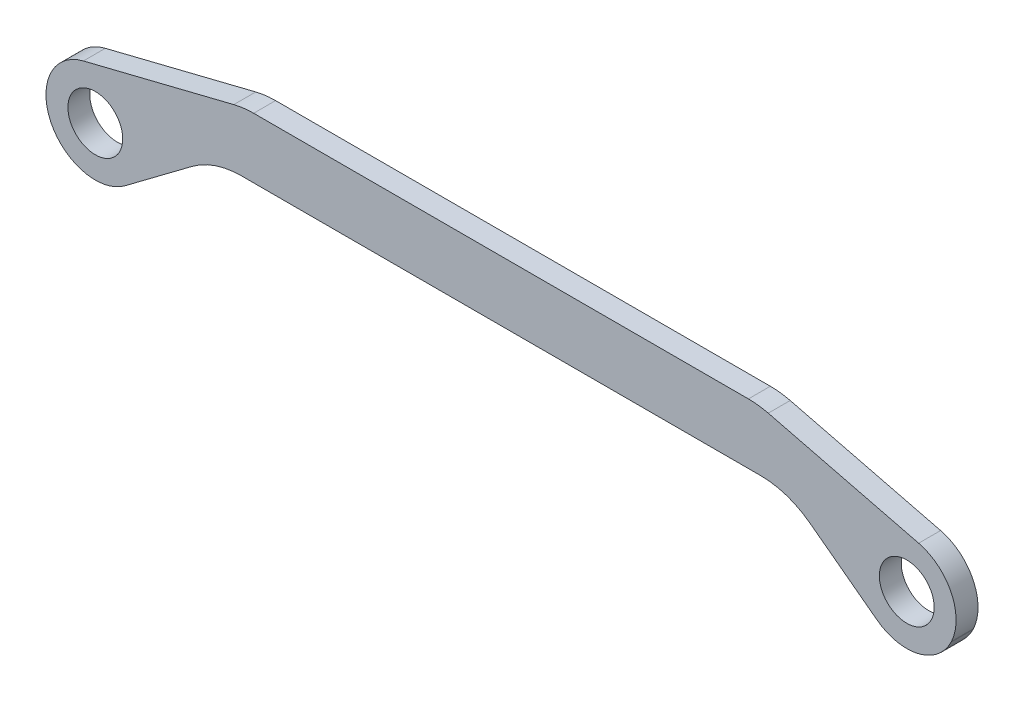
ISO-10303-21;
HEADER;
FILE_DESCRIPTION(('STEP AP214'),'2;1');
FILE_NAME('part.step','',(''),(''),'','','');
FILE_SCHEMA(('AUTOMOTIVE_DESIGN { 1 0 10303 214 1 1 1 1 }'));
ENDSEC;
DATA;
#1=APPLICATION_CONTEXT('core data for automotive mechanical design processes');
#2=APPLICATION_PROTOCOL_DEFINITION('international standard','automotive_design',2000,#1);
#3=PRODUCT_CONTEXT('',#1,'mechanical');
#4=PRODUCT('Part','Part','',(#3));
#5=PRODUCT_RELATED_PRODUCT_CATEGORY('part','',(#4));
#6=PRODUCT_DEFINITION_FORMATION('','',#4);
#7=PRODUCT_DEFINITION_CONTEXT('part definition',#1,'design');
#8=PRODUCT_DEFINITION('design','',#6,#7);
#9=PRODUCT_DEFINITION_SHAPE('','',#8);
#10=(LENGTH_UNIT() NAMED_UNIT(*) SI_UNIT(.MILLI.,.METRE.));
#11=(NAMED_UNIT(*) PLANE_ANGLE_UNIT() SI_UNIT($,.RADIAN.));
#12=(NAMED_UNIT(*) SI_UNIT($,.STERADIAN.) SOLID_ANGLE_UNIT());
#13=UNCERTAINTY_MEASURE_WITH_UNIT(LENGTH_MEASURE(1.E-05),#10,'distance_accuracy_value','');
#14=(GEOMETRIC_REPRESENTATION_CONTEXT(3) GLOBAL_UNCERTAINTY_ASSIGNED_CONTEXT((#13)) GLOBAL_UNIT_ASSIGNED_CONTEXT((#10,
#11,#12)) REPRESENTATION_CONTEXT('',''));
#15=CARTESIAN_POINT('',(0.,0.,0.));
#16=DIRECTION('',(0.,0.,1.));
#17=DIRECTION('',(1.,0.,0.));
#18=AXIS2_PLACEMENT_3D('',#15,#16,#17);
#19=CARTESIAN_POINT('',(121.332629297453,-9.99999997392392,4.));
#20=DIRECTION('',(0.,0.,1.));
#21=DIRECTION('',(1.,0.,0.));
#22=AXIS2_PLACEMENT_3D('',#19,#20,#21);
#23=PLANE('',#22);
#24=CARTESIAN_POINT('',(148.,-1.56819002228303E-12,4.));
#25=DIRECTION('',(0.,0.,1.));
#26=DIRECTION('',(1.,0.,0.));
#27=AXIS2_PLACEMENT_3D('',#24,#25,#26);
#28=CIRCLE('',#27,4.99999999999999);
#29=CARTESIAN_POINT('',(153.,-1.56819002228303E-12,4.));
#30=VERTEX_POINT('',#29);
#31=EDGE_CURVE('E329',#30,#30,#28,.T.);
#32=ORIENTED_EDGE('',*,*,#31,.F.);
#33=EDGE_LOOP('',(#32));
#34=FACE_BOUND('',#33,.T.);
#35=CARTESIAN_POINT('',(0.,0.,4.));
#36=DIRECTION('',(0.,0.,1.));
#37=DIRECTION('',(1.,0.,0.));
#38=AXIS2_PLACEMENT_3D('',#35,#36,#37);
#39=CIRCLE('',#38,5.);
#40=CARTESIAN_POINT('',(5.,0.,4.));
#41=VERTEX_POINT('',#40);
#42=EDGE_CURVE('E331',#41,#41,#39,.T.);
#43=ORIENTED_EDGE('',*,*,#42,.F.);
#44=EDGE_LOOP('',(#43));
#45=FACE_BOUND('',#44,.T.);
#46=CARTESIAN_POINT('',(121.332629297453,-9.99999997392392,4.));
#47=DIRECTION('',(0.,0.,-1.));
#48=DIRECTION('',(1.,0.,0.));
#49=AXIS2_PLACEMENT_3D('',#46,#47,#48);
#50=CIRCLE('',#49,15.);
#51=CARTESIAN_POINT('',(121.33262929745,5.00000002607608,4.));
#52=VERTEX_POINT('',#51);
#53=CARTESIAN_POINT('',(130.332298736199,2.00024793990246,4.));
#54=VERTEX_POINT('',#53);
#55=EDGE_CURVE('E210',#52,#54,#50,.T.);
#56=ORIENTED_EDGE('',*,*,#55,.T.);
#57=DIRECTION('',(0.800016527588369,-0.599977962583167,0.));
#58=VECTOR('',#57,1.);
#59=CARTESIAN_POINT('',(142.599999999998,-7.2000000000005,4.));
#60=LINE('',#59,#58);
#61=CARTESIAN_POINT('',(142.599999999998,-7.2000000000005,4.));
#62=VERTEX_POINT('',#61);
#63=EDGE_CURVE('E119',#54,#62,#60,.T.);
#64=ORIENTED_EDGE('',*,*,#63,.T.);
#65=CARTESIAN_POINT('',(148.,-1.56819002228303E-12,4.));
#66=DIRECTION('',(0.,0.,1.));
#67=DIRECTION('',(1.,0.,0.));
#68=AXIS2_PLACEMENT_3D('',#65,#66,#67);
#69=CIRCLE('',#68,8.99999999999999);
#70=CARTESIAN_POINT('',(156.085333124794,-3.95314915745922,4.));
#71=VERTEX_POINT('',#70);
#72=EDGE_CURVE('E249',#62,#71,#69,.T.);
#73=ORIENTED_EDGE('',*,*,#72,.T.);
#74=DIRECTION('',(0.429229943063168,0.9031952479824,0.));
#75=VECTOR('',#74,1.);
#76=CARTESIAN_POINT('',(156.171177788613,-3.77251289552331,4.));
#77=LINE('',#76,#75);
#78=CARTESIAN_POINT('',(156.171177788613,-3.77251289552331,4.));
#79=VERTEX_POINT('',#78);
#80=EDGE_CURVE('E267',#71,#79,#77,.T.);
#81=ORIENTED_EDGE('',*,*,#80,.T.);
#82=CARTESIAN_POINT('',(148.,-1.56819002228303E-12,4.));
#83=DIRECTION('',(0.,0.,1.));
#84=DIRECTION('',(1.,0.,0.));
#85=AXIS2_PLACEMENT_3D('',#82,#83,#84);
#86=CIRCLE('',#85,8.99999999999998);
#87=CARTESIAN_POINT('',(150.172338317194,8.73389639482972,4.));
#88=VERTEX_POINT('',#87);
#89=EDGE_CURVE('E264',#79,#88,#86,.T.);
#90=ORIENTED_EDGE('',*,*,#89,.T.);
#91=DIRECTION('',(-0.970436773368448,0.241355482420092,0.));
#92=VECTOR('',#91,1.);
#93=CARTESIAN_POINT('',(122.739948861459,15.5565537515197,4.));
#94=LINE('',#93,#92);
#95=CARTESIAN_POINT('',(122.739948861459,15.5565537515197,4.));
#96=VERTEX_POINT('',#95);
#97=EDGE_CURVE('E266',#88,#96,#94,.T.);
#98=ORIENTED_EDGE('',*,*,#97,.T.);
#99=CARTESIAN_POINT('',(119.119616625156,1.00000215099347,4.));
#100=DIRECTION('',(0.,0.,1.));
#101=DIRECTION('',(1.,0.,0.));
#102=AXIS2_PLACEMENT_3D('',#99,#100,#101);
#103=CIRCLE('',#102,15.);
#104=CARTESIAN_POINT('',(119.119616625154,16.0000021509935,4.));
#105=VERTEX_POINT('',#104);
#106=EDGE_CURVE('E269',#96,#105,#103,.T.);
#107=ORIENTED_EDGE('',*,*,#106,.T.);
#108=DIRECTION('',(-1.,0.,0.));
#109=VECTOR('',#108,1.);
#110=CARTESIAN_POINT('',(28.8803857389154,16.0000021509954,4.));
#111=LINE('',#110,#109);
#112=CARTESIAN_POINT('',(28.8803857389154,16.0000021509954,4.));
#113=VERTEX_POINT('',#112);
#114=EDGE_CURVE('E275',#105,#113,#111,.T.);
#115=ORIENTED_EDGE('',*,*,#114,.T.);
#116=CARTESIAN_POINT('',(28.8803857389175,1.00000215099541,4.));
#117=DIRECTION('',(0.,0.,1.));
#118=DIRECTION('',(1.,0.,0.));
#119=AXIS2_PLACEMENT_3D('',#116,#117,#118);
#120=CIRCLE('',#119,15.);
#121=CARTESIAN_POINT('',(25.2600544080469,15.5565539767101,4.));
#122=VERTEX_POINT('',#121);
#123=EDGE_CURVE('E277',#113,#122,#120,.T.);
#124=ORIENTED_EDGE('',*,*,#123,.T.);
#125=DIRECTION('',(-0.97043679160028,-0.241355409113936,0.));
#126=VECTOR('',#125,1.);
#127=CARTESIAN_POINT('',(-2.17234329399818,8.73389676950018,4.));
#128=LINE('',#127,#126);
#129=CARTESIAN_POINT('',(-2.17234329399818,8.73389676950018,4.));
#130=VERTEX_POINT('',#129);
#131=EDGE_CURVE('E279',#122,#130,#128,.T.);
#132=ORIENTED_EDGE('',*,*,#131,.T.);
#133=CARTESIAN_POINT('',(4.27523098763427E-07,1.71886169370825E-06,4.));
#134=DIRECTION('',(0.,0.,1.));
#135=DIRECTION('',(1.,0.,0.));
#136=AXIS2_PLACEMENT_3D('',#133,#134,#135);
#137=CIRCLE('',#136,9.00000000000002);
#138=CARTESIAN_POINT('',(-8.1711773610897,-3.7725111766605,4.));
#139=VERTEX_POINT('',#138);
#140=EDGE_CURVE('E281',#130,#139,#137,.T.);
#141=ORIENTED_EDGE('',*,*,#140,.T.);
#142=DIRECTION('',(0.429229943063321,-0.903195247982327,0.));
#143=VECTOR('',#142,1.);
#144=CARTESIAN_POINT('',(-8.1711773610897,-3.77251117666051,4.));
#145=LINE('',#144,#143);
#146=CARTESIAN_POINT('',(-8.08533269727051,-3.95314743859691,4.));
#147=VERTEX_POINT('',#146);
#148=EDGE_CURVE('E283',#139,#147,#145,.T.);
#149=ORIENTED_EDGE('',*,*,#148,.T.);
#150=CARTESIAN_POINT('',(4.27523098763427E-07,1.71886169370825E-06,4.));
#151=DIRECTION('',(0.,0.,1.));
#152=DIRECTION('',(1.,0.,0.));
#153=AXIS2_PLACEMENT_3D('',#150,#151,#152);
#154=CIRCLE('',#153,9.00000000000002);
#155=CARTESIAN_POINT('',(5.40000042752305,-7.19999828113837,4.));
#156=VERTEX_POINT('',#155);
#157=EDGE_CURVE('E161',#147,#156,#154,.T.);
#158=ORIENTED_EDGE('',*,*,#157,.T.);
#159=DIRECTION('',(0.800016528778697,0.599977960995972,0.));
#160=VECTOR('',#159,1.);
#161=CARTESIAN_POINT('',(17.667701777501,2.00024968536747,4.));
#162=LINE('',#161,#160);
#163=CARTESIAN_POINT('',(17.667701777501,2.00024968536747,4.));
#164=VERTEX_POINT('',#163);
#165=EDGE_CURVE('E156',#156,#164,#162,.T.);
#166=ORIENTED_EDGE('',*,*,#165,.T.);
#167=CARTESIAN_POINT('',(26.6673688888286,-9.99999997392242,4.));
#168=DIRECTION('',(0.,0.,-1.));
#169=DIRECTION('',(1.,0.,0.));
#170=AXIS2_PLACEMENT_3D('',#167,#168,#169);
#171=CIRCLE('',#170,15.);
#172=CARTESIAN_POINT('',(26.6673707532495,5.00000002607746,4.));
#173=VERTEX_POINT('',#172);
#174=EDGE_CURVE('E159',#164,#173,#171,.T.);
#175=ORIENTED_EDGE('',*,*,#174,.T.);
#176=DIRECTION('',(1.,0.,0.));
#177=VECTOR('',#176,1.);
#178=CARTESIAN_POINT('',(121.33262929745,5.00000002607608,4.));
#179=LINE('',#178,#177);
#180=EDGE_CURVE('E52',#173,#52,#179,.T.);
#181=ORIENTED_EDGE('',*,*,#180,.T.);
#182=EDGE_LOOP('',(#56,#64,#73,#81,#90,#98,#107,#115,#124,#132,#141,#149,#158,#166,#175,#181));
#183=FACE_BOUND('',#182,.T.);
#184=ADVANCED_FACE('F35',(#34,#45,#183),#23,.T.);
#185=CARTESIAN_POINT('',(121.332629297453,-9.99999997392392,0.));
#186=DIRECTION('',(0.,0.,1.));
#187=DIRECTION('',(1.,0.,0.));
#188=AXIS2_PLACEMENT_3D('',#185,#186,#187);
#189=PLANE('',#188);
#190=CARTESIAN_POINT('',(148.,-1.56819002228303E-12,0.));
#191=DIRECTION('',(0.,0.,1.));
#192=DIRECTION('',(1.,0.,0.));
#193=AXIS2_PLACEMENT_3D('',#190,#191,#192);
#194=CIRCLE('',#193,4.99999999999999);
#195=CARTESIAN_POINT('',(153.,-1.56819002228303E-12,0.));
#196=VERTEX_POINT('',#195);
#197=EDGE_CURVE('E327',#196,#196,#194,.T.);
#198=ORIENTED_EDGE('',*,*,#197,.T.);
#199=EDGE_LOOP('',(#198));
#200=FACE_BOUND('',#199,.T.);
#201=CARTESIAN_POINT('',(0.,0.,0.));
#202=DIRECTION('',(0.,0.,1.));
#203=DIRECTION('',(1.,0.,0.));
#204=AXIS2_PLACEMENT_3D('',#201,#202,#203);
#205=CIRCLE('',#204,5.);
#206=CARTESIAN_POINT('',(5.,0.,0.));
#207=VERTEX_POINT('',#206);
#208=EDGE_CURVE('E183',#207,#207,#205,.T.);
#209=ORIENTED_EDGE('',*,*,#208,.T.);
#210=EDGE_LOOP('',(#209));
#211=FACE_BOUND('',#210,.T.);
#212=CARTESIAN_POINT('',(121.332629297453,-9.99999997392392,0.));
#213=DIRECTION('',(0.,0.,-1.));
#214=DIRECTION('',(1.,0.,0.));
#215=AXIS2_PLACEMENT_3D('',#212,#213,#214);
#216=CIRCLE('',#215,15.);
#217=CARTESIAN_POINT('',(121.33262929745,5.00000002607608,0.));
#218=VERTEX_POINT('',#217);
#219=CARTESIAN_POINT('',(130.332298736199,2.00024793990246,0.));
#220=VERTEX_POINT('',#219);
#221=EDGE_CURVE('E179',#218,#220,#216,.T.);
#222=ORIENTED_EDGE('',*,*,#221,.F.);
#223=DIRECTION('',(1.,0.,0.));
#224=VECTOR('',#223,1.);
#225=CARTESIAN_POINT('',(121.33262929745,5.00000002607608,0.));
#226=LINE('',#225,#224);
#227=CARTESIAN_POINT('',(26.6673707532495,5.00000002607746,0.));
#228=VERTEX_POINT('',#227);
#229=EDGE_CURVE('E111',#228,#218,#226,.T.);
#230=ORIENTED_EDGE('',*,*,#229,.F.);
#231=CARTESIAN_POINT('',(26.6673688888286,-9.99999997392242,0.));
#232=DIRECTION('',(0.,0.,-1.));
#233=DIRECTION('',(1.,0.,0.));
#234=AXIS2_PLACEMENT_3D('',#231,#232,#233);
#235=CIRCLE('',#234,15.);
#236=CARTESIAN_POINT('',(17.667701777501,2.00024968536747,0.));
#237=VERTEX_POINT('',#236);
#238=EDGE_CURVE('E105',#237,#228,#235,.T.);
#239=ORIENTED_EDGE('',*,*,#238,.F.);
#240=DIRECTION('',(0.800016528778697,0.599977960995972,0.));
#241=VECTOR('',#240,1.);
#242=CARTESIAN_POINT('',(17.667701777501,2.00024968536747,0.));
#243=LINE('',#242,#241);
#244=CARTESIAN_POINT('',(5.40000042752305,-7.19999828113837,0.));
#245=VERTEX_POINT('',#244);
#246=EDGE_CURVE('E169',#245,#237,#243,.T.);
#247=ORIENTED_EDGE('',*,*,#246,.F.);
#248=CARTESIAN_POINT('',(4.27523098763427E-07,1.71886169370825E-06,0.));
#249=DIRECTION('',(0.,0.,1.));
#250=DIRECTION('',(1.,0.,0.));
#251=AXIS2_PLACEMENT_3D('',#248,#249,#250);
#252=CIRCLE('',#251,9.00000000000002);
#253=CARTESIAN_POINT('',(-8.08533269727051,-3.95314743859691,0.));
#254=VERTEX_POINT('',#253);
#255=EDGE_CURVE('E205',#254,#245,#252,.T.);
#256=ORIENTED_EDGE('',*,*,#255,.F.);
#257=DIRECTION('',(0.429229943063321,-0.903195247982327,0.));
#258=VECTOR('',#257,1.);
#259=CARTESIAN_POINT('',(-8.1711773610897,-3.77251117666051,0.));
#260=LINE('',#259,#258);
#261=CARTESIAN_POINT('',(-8.1711773610897,-3.7725111766605,0.));
#262=VERTEX_POINT('',#261);
#263=EDGE_CURVE('E203',#262,#254,#260,.T.);
#264=ORIENTED_EDGE('',*,*,#263,.F.);
#265=CARTESIAN_POINT('',(4.27523098763427E-07,1.71886169370825E-06,0.));
#266=DIRECTION('',(0.,0.,1.));
#267=DIRECTION('',(1.,0.,0.));
#268=AXIS2_PLACEMENT_3D('',#265,#266,#267);
#269=CIRCLE('',#268,9.00000000000002);
#270=CARTESIAN_POINT('',(-2.17234329399818,8.73389676950018,0.));
#271=VERTEX_POINT('',#270);
#272=EDGE_CURVE('E201',#271,#262,#269,.T.);
#273=ORIENTED_EDGE('',*,*,#272,.F.);
#274=DIRECTION('',(-0.97043679160028,-0.241355409113936,0.));
#275=VECTOR('',#274,1.);
#276=CARTESIAN_POINT('',(-2.17234329399818,8.73389676950018,0.));
#277=LINE('',#276,#275);
#278=CARTESIAN_POINT('',(25.2600544080469,15.5565539767101,0.));
#279=VERTEX_POINT('',#278);
#280=EDGE_CURVE('E199',#279,#271,#277,.T.);
#281=ORIENTED_EDGE('',*,*,#280,.F.);
#282=CARTESIAN_POINT('',(28.8803857389175,1.00000215099541,0.));
#283=DIRECTION('',(0.,0.,1.));
#284=DIRECTION('',(1.,0.,0.));
#285=AXIS2_PLACEMENT_3D('',#282,#283,#284);
#286=CIRCLE('',#285,15.);
#287=CARTESIAN_POINT('',(28.8803857389154,16.0000021509954,0.));
#288=VERTEX_POINT('',#287);
#289=EDGE_CURVE('E197',#288,#279,#286,.T.);
#290=ORIENTED_EDGE('',*,*,#289,.F.);
#291=DIRECTION('',(-1.,0.,0.));
#292=VECTOR('',#291,1.);
#293=CARTESIAN_POINT('',(28.8803857389154,16.0000021509954,0.));
#294=LINE('',#293,#292);
#295=CARTESIAN_POINT('',(119.119616625154,16.0000021509935,0.));
#296=VERTEX_POINT('',#295);
#297=EDGE_CURVE('E195',#296,#288,#294,.T.);
#298=ORIENTED_EDGE('',*,*,#297,.F.);
#299=CARTESIAN_POINT('',(119.119616625156,1.00000215099347,0.));
#300=DIRECTION('',(0.,0.,1.));
#301=DIRECTION('',(1.,0.,0.));
#302=AXIS2_PLACEMENT_3D('',#299,#300,#301);
#303=CIRCLE('',#302,15.);
#304=CARTESIAN_POINT('',(122.739948861459,15.5565537515197,0.));
#305=VERTEX_POINT('',#304);
#306=EDGE_CURVE('E193',#305,#296,#303,.T.);
#307=ORIENTED_EDGE('',*,*,#306,.F.);
#308=DIRECTION('',(-0.970436773368448,0.241355482420092,0.));
#309=VECTOR('',#308,1.);
#310=CARTESIAN_POINT('',(122.739948861459,15.5565537515197,0.));
#311=LINE('',#310,#309);
#312=CARTESIAN_POINT('',(150.172338317194,8.73389639482972,0.));
#313=VERTEX_POINT('',#312);
#314=EDGE_CURVE('E191',#313,#305,#311,.T.);
#315=ORIENTED_EDGE('',*,*,#314,.F.);
#316=CARTESIAN_POINT('',(148.,-1.56819002228303E-12,0.));
#317=DIRECTION('',(0.,0.,1.));
#318=DIRECTION('',(1.,0.,0.));
#319=AXIS2_PLACEMENT_3D('',#316,#317,#318);
#320=CIRCLE('',#319,8.99999999999998);
#321=CARTESIAN_POINT('',(156.171177788613,-3.77251289552331,0.));
#322=VERTEX_POINT('',#321);
#323=EDGE_CURVE('E189',#322,#313,#320,.T.);
#324=ORIENTED_EDGE('',*,*,#323,.F.);
#325=DIRECTION('',(0.429229943063168,0.9031952479824,0.));
#326=VECTOR('',#325,1.);
#327=CARTESIAN_POINT('',(156.171177788613,-3.77251289552331,0.));
#328=LINE('',#327,#326);
#329=CARTESIAN_POINT('',(156.085333124794,-3.95314915745922,0.));
#330=VERTEX_POINT('',#329);
#331=EDGE_CURVE('E187',#330,#322,#328,.T.);
#332=ORIENTED_EDGE('',*,*,#331,.F.);
#333=CARTESIAN_POINT('',(148.,-1.56819002228303E-12,0.));
#334=DIRECTION('',(0.,0.,1.));
#335=DIRECTION('',(1.,0.,0.));
#336=AXIS2_PLACEMENT_3D('',#333,#334,#335);
#337=CIRCLE('',#336,8.99999999999999);
#338=CARTESIAN_POINT('',(142.599999999998,-7.2000000000005,0.));
#339=VERTEX_POINT('',#338);
#340=EDGE_CURVE('E185',#339,#330,#337,.T.);
#341=ORIENTED_EDGE('',*,*,#340,.F.);
#342=DIRECTION('',(0.800016527588369,-0.599977962583167,0.));
#343=VECTOR('',#342,1.);
#344=CARTESIAN_POINT('',(142.599999999998,-7.2000000000005,0.));
#345=LINE('',#344,#343);
#346=EDGE_CURVE('E182',#220,#339,#345,.T.);
#347=ORIENTED_EDGE('',*,*,#346,.F.);
#348=EDGE_LOOP('',(#222,#230,#239,#247,#256,#264,#273,#281,#290,#298,#307,#315,#324,#332,#341,#347));
#349=FACE_BOUND('',#348,.T.);
#350=ADVANCED_FACE('F253',(#200,#211,#349),#189,.F.);
#351=CARTESIAN_POINT('',(121.332629297453,-9.99999997392392,4.));
#352=DIRECTION('',(0.,0.,-1.));
#353=DIRECTION('',(-1.,0.,0.));
#354=AXIS2_PLACEMENT_3D('',#351,#352,#353);
#355=CYLINDRICAL_SURFACE('',#354,15.);
#356=ORIENTED_EDGE('',*,*,#221,.T.);
#357=DIRECTION('',(0.,0.,-1.));
#358=VECTOR('',#357,1.);
#359=CARTESIAN_POINT('',(130.332298736199,2.00024793990246,4.));
#360=LINE('',#359,#358);
#361=EDGE_CURVE('E11',#54,#220,#360,.T.);
#362=ORIENTED_EDGE('',*,*,#361,.F.);
#363=ORIENTED_EDGE('',*,*,#55,.F.);
#364=DIRECTION('',(0.,0.,-1.));
#365=VECTOR('',#364,1.);
#366=CARTESIAN_POINT('',(121.33262929745,5.00000002607608,4.));
#367=LINE('',#366,#365);
#368=EDGE_CURVE('E175',#52,#218,#367,.T.);
#369=ORIENTED_EDGE('',*,*,#368,.T.);
#370=EDGE_LOOP('',(#356,#362,#363,#369));
#371=FACE_BOUND('',#370,.T.);
#372=ADVANCED_FACE('F37',(#371),#355,.F.);
#373=CARTESIAN_POINT('',(142.599999999998,-7.2000000000005,4.));
#374=DIRECTION('',(0.599977962583167,0.800016527588369,0.));
#375=DIRECTION('',(-0.800016527588369,0.599977962583167,0.));
#376=AXIS2_PLACEMENT_3D('',#373,#374,#375);
#377=PLANE('',#376);
#378=ORIENTED_EDGE('',*,*,#346,.T.);
#379=DIRECTION('',(0.,0.,-1.));
#380=VECTOR('',#379,1.);
#381=CARTESIAN_POINT('',(142.599999999998,-7.2000000000005,4.));
#382=LINE('',#381,#380);
#383=EDGE_CURVE('E44',#62,#339,#382,.T.);
#384=ORIENTED_EDGE('',*,*,#383,.F.);
#385=ORIENTED_EDGE('',*,*,#63,.F.);
#386=ORIENTED_EDGE('',*,*,#361,.T.);
#387=EDGE_LOOP('',(#378,#384,#385,#386));
#388=FACE_BOUND('',#387,.T.);
#389=ADVANCED_FACE('F365',(#388),#377,.F.);
#390=CARTESIAN_POINT('',(148.,-1.56819002228303E-12,4.));
#391=DIRECTION('',(0.,0.,-1.));
#392=DIRECTION('',(-1.,0.,0.));
#393=AXIS2_PLACEMENT_3D('',#390,#391,#392);
#394=CYLINDRICAL_SURFACE('',#393,8.99999999999999);
#395=ORIENTED_EDGE('',*,*,#340,.T.);
#396=DIRECTION('',(0.,0.,-1.));
#397=VECTOR('',#396,1.);
#398=CARTESIAN_POINT('',(156.085333124794,-3.95314915745922,4.));
#399=LINE('',#398,#397);
#400=EDGE_CURVE('E241',#71,#330,#399,.T.);
#401=ORIENTED_EDGE('',*,*,#400,.F.);
#402=ORIENTED_EDGE('',*,*,#72,.F.);
#403=ORIENTED_EDGE('',*,*,#383,.T.);
#404=EDGE_LOOP('',(#395,#401,#402,#403));
#405=FACE_BOUND('',#404,.T.);
#406=ADVANCED_FACE('F247',(#405),#394,.T.);
#407=CARTESIAN_POINT('',(156.171177788613,-3.77251289552331,4.));
#408=DIRECTION('',(-0.9031952479824,0.429229943063168,0.));
#409=DIRECTION('',(-0.429229943063168,-0.9031952479824,0.));
#410=AXIS2_PLACEMENT_3D('',#407,#408,#409);
#411=PLANE('',#410);
#412=ORIENTED_EDGE('',*,*,#331,.T.);
#413=DIRECTION('',(0.,0.,-1.));
#414=VECTOR('',#413,1.);
#415=CARTESIAN_POINT('',(156.171177788613,-3.77251289552331,4.));
#416=LINE('',#415,#414);
#417=EDGE_CURVE('E238',#79,#322,#416,.T.);
#418=ORIENTED_EDGE('',*,*,#417,.F.);
#419=ORIENTED_EDGE('',*,*,#80,.F.);
#420=ORIENTED_EDGE('',*,*,#400,.T.);
#421=EDGE_LOOP('',(#412,#418,#419,#420));
#422=FACE_BOUND('',#421,.T.);
#423=ADVANCED_FACE('F258',(#422),#411,.F.);
#424=CARTESIAN_POINT('',(148.,-1.56819002228303E-12,4.));
#425=DIRECTION('',(0.,0.,-1.));
#426=DIRECTION('',(-1.,0.,0.));
#427=AXIS2_PLACEMENT_3D('',#424,#425,#426);
#428=CYLINDRICAL_SURFACE('',#427,8.99999999999998);
#429=ORIENTED_EDGE('',*,*,#323,.T.);
#430=DIRECTION('',(0.,0.,-1.));
#431=VECTOR('',#430,1.);
#432=CARTESIAN_POINT('',(150.172338317194,8.73389639482972,4.));
#433=LINE('',#432,#431);
#434=EDGE_CURVE('E235',#88,#313,#433,.T.);
#435=ORIENTED_EDGE('',*,*,#434,.F.);
#436=ORIENTED_EDGE('',*,*,#89,.F.);
#437=ORIENTED_EDGE('',*,*,#417,.T.);
#438=EDGE_LOOP('',(#429,#435,#436,#437));
#439=FACE_BOUND('',#438,.T.);
#440=ADVANCED_FACE('F262',(#439),#428,.T.);
#441=CARTESIAN_POINT('',(122.739948861459,15.5565537515197,4.));
#442=DIRECTION('',(-0.241355482420092,-0.970436773368448,0.));
#443=DIRECTION('',(0.970436773368448,-0.241355482420092,0.));
#444=AXIS2_PLACEMENT_3D('',#441,#442,#443);
#445=PLANE('',#444);
#446=ORIENTED_EDGE('',*,*,#314,.T.);
#447=DIRECTION('',(0.,0.,-1.));
#448=VECTOR('',#447,1.);
#449=CARTESIAN_POINT('',(122.739948861459,15.5565537515197,4.));
#450=LINE('',#449,#448);
#451=EDGE_CURVE('E232',#96,#305,#450,.T.);
#452=ORIENTED_EDGE('',*,*,#451,.F.);
#453=ORIENTED_EDGE('',*,*,#97,.F.);
#454=ORIENTED_EDGE('',*,*,#434,.T.);
#455=EDGE_LOOP('',(#446,#452,#453,#454));
#456=FACE_BOUND('',#455,.T.);
#457=ADVANCED_FACE('F387',(#456),#445,.F.);
#458=CARTESIAN_POINT('',(119.119616625156,1.00000215099347,4.));
#459=DIRECTION('',(0.,0.,-1.));
#460=DIRECTION('',(-1.,0.,0.));
#461=AXIS2_PLACEMENT_3D('',#458,#459,#460);
#462=CYLINDRICAL_SURFACE('',#461,15.);
#463=ORIENTED_EDGE('',*,*,#306,.T.);
#464=DIRECTION('',(0.,0.,-1.));
#465=VECTOR('',#464,1.);
#466=CARTESIAN_POINT('',(119.119616625154,16.0000021509935,4.));
#467=LINE('',#466,#465);
#468=EDGE_CURVE('E229',#105,#296,#467,.T.);
#469=ORIENTED_EDGE('',*,*,#468,.F.);
#470=ORIENTED_EDGE('',*,*,#106,.F.);
#471=ORIENTED_EDGE('',*,*,#451,.T.);
#472=EDGE_LOOP('',(#463,#469,#470,#471));
#473=FACE_BOUND('',#472,.T.);
#474=ADVANCED_FACE('F394',(#473),#462,.T.);
#475=CARTESIAN_POINT('',(28.8803857389154,16.0000021509954,4.));
#476=DIRECTION('',(0.,-1.,0.));
#477=DIRECTION('',(1.,0.,0.));
#478=AXIS2_PLACEMENT_3D('',#475,#476,#477);
#479=PLANE('',#478);
#480=ORIENTED_EDGE('',*,*,#297,.T.);
#481=DIRECTION('',(0.,0.,-1.));
#482=VECTOR('',#481,1.);
#483=CARTESIAN_POINT('',(28.8803857389154,16.0000021509954,4.));
#484=LINE('',#483,#482);
#485=EDGE_CURVE('E226',#113,#288,#484,.T.);
#486=ORIENTED_EDGE('',*,*,#485,.F.);
#487=ORIENTED_EDGE('',*,*,#114,.F.);
#488=ORIENTED_EDGE('',*,*,#468,.T.);
#489=EDGE_LOOP('',(#480,#486,#487,#488));
#490=FACE_BOUND('',#489,.T.);
#491=ADVANCED_FACE('F402',(#490),#479,.F.);
#492=CARTESIAN_POINT('',(28.8803857389175,1.00000215099541,4.));
#493=DIRECTION('',(0.,0.,-1.));
#494=DIRECTION('',(-1.,0.,0.));
#495=AXIS2_PLACEMENT_3D('',#492,#493,#494);
#496=CYLINDRICAL_SURFACE('',#495,15.);
#497=ORIENTED_EDGE('',*,*,#289,.T.);
#498=DIRECTION('',(0.,0.,-1.));
#499=VECTOR('',#498,1.);
#500=CARTESIAN_POINT('',(25.2600544080469,15.5565539767101,4.));
#501=LINE('',#500,#499);
#502=EDGE_CURVE('E223',#122,#279,#501,.T.);
#503=ORIENTED_EDGE('',*,*,#502,.F.);
#504=ORIENTED_EDGE('',*,*,#123,.F.);
#505=ORIENTED_EDGE('',*,*,#485,.T.);
#506=EDGE_LOOP('',(#497,#503,#504,#505));
#507=FACE_BOUND('',#506,.T.);
#508=ADVANCED_FACE('F410',(#507),#496,.T.);
#509=CARTESIAN_POINT('',(-2.17234329399818,8.73389676950018,4.));
#510=DIRECTION('',(0.241355409113936,-0.97043679160028,0.));
#511=DIRECTION('',(0.97043679160028,0.241355409113936,0.));
#512=AXIS2_PLACEMENT_3D('',#509,#510,#511);
#513=PLANE('',#512);
#514=ORIENTED_EDGE('',*,*,#280,.T.);
#515=DIRECTION('',(0.,0.,-1.));
#516=VECTOR('',#515,1.);
#517=CARTESIAN_POINT('',(-2.17234329399818,8.73389676950018,4.));
#518=LINE('',#517,#516);
#519=EDGE_CURVE('E220',#130,#271,#518,.T.);
#520=ORIENTED_EDGE('',*,*,#519,.F.);
#521=ORIENTED_EDGE('',*,*,#131,.F.);
#522=ORIENTED_EDGE('',*,*,#502,.T.);
#523=EDGE_LOOP('',(#514,#520,#521,#522));
#524=FACE_BOUND('',#523,.T.);
#525=ADVANCED_FACE('F418',(#524),#513,.F.);
#526=CARTESIAN_POINT('',(4.27523098763427E-07,1.71886169370825E-06,4.));
#527=DIRECTION('',(0.,0.,-1.));
#528=DIRECTION('',(-1.,0.,0.));
#529=AXIS2_PLACEMENT_3D('',#526,#527,#528);
#530=CYLINDRICAL_SURFACE('',#529,9.00000000000002);
#531=ORIENTED_EDGE('',*,*,#272,.T.);
#532=DIRECTION('',(0.,0.,-1.));
#533=VECTOR('',#532,1.);
#534=CARTESIAN_POINT('',(-8.1711773610897,-3.7725111766605,4.));
#535=LINE('',#534,#533);
#536=EDGE_CURVE('E217',#139,#262,#535,.T.);
#537=ORIENTED_EDGE('',*,*,#536,.F.);
#538=ORIENTED_EDGE('',*,*,#140,.F.);
#539=ORIENTED_EDGE('',*,*,#519,.T.);
#540=EDGE_LOOP('',(#531,#537,#538,#539));
#541=FACE_BOUND('',#540,.T.);
#542=ADVANCED_FACE('F426',(#541),#530,.T.);
#543=CARTESIAN_POINT('',(-8.1711773610897,-3.77251117666051,4.));
#544=DIRECTION('',(0.903195247982327,0.429229943063321,0.));
#545=DIRECTION('',(-0.429229943063321,0.903195247982328,0.));
#546=AXIS2_PLACEMENT_3D('',#543,#544,#545);
#547=PLANE('',#546);
#548=ORIENTED_EDGE('',*,*,#263,.T.);
#549=DIRECTION('',(0.,0.,-1.));
#550=VECTOR('',#549,1.);
#551=CARTESIAN_POINT('',(-8.08533269727051,-3.95314743859691,4.));
#552=LINE('',#551,#550);
#553=EDGE_CURVE('E214',#147,#254,#552,.T.);
#554=ORIENTED_EDGE('',*,*,#553,.F.);
#555=ORIENTED_EDGE('',*,*,#148,.F.);
#556=ORIENTED_EDGE('',*,*,#536,.T.);
#557=EDGE_LOOP('',(#548,#554,#555,#556));
#558=FACE_BOUND('',#557,.T.);
#559=ADVANCED_FACE('F289',(#558),#547,.F.);
#560=CARTESIAN_POINT('',(4.27523098763427E-07,1.71886169370825E-06,4.));
#561=DIRECTION('',(0.,0.,-1.));
#562=DIRECTION('',(-1.,0.,0.));
#563=AXIS2_PLACEMENT_3D('',#560,#561,#562);
#564=CYLINDRICAL_SURFACE('',#563,9.00000000000002);
#565=ORIENTED_EDGE('',*,*,#255,.T.);
#566=DIRECTION('',(0.,0.,-1.));
#567=VECTOR('',#566,1.);
#568=CARTESIAN_POINT('',(5.40000042752305,-7.19999828113837,4.));
#569=LINE('',#568,#567);
#570=EDGE_CURVE('E170',#156,#245,#569,.T.);
#571=ORIENTED_EDGE('',*,*,#570,.F.);
#572=ORIENTED_EDGE('',*,*,#157,.F.);
#573=ORIENTED_EDGE('',*,*,#553,.T.);
#574=EDGE_LOOP('',(#565,#571,#572,#573));
#575=FACE_BOUND('',#574,.T.);
#576=ADVANCED_FACE('F293',(#575),#564,.T.);
#577=CARTESIAN_POINT('',(17.667701777501,2.00024968536747,4.));
#578=DIRECTION('',(-0.599977960995972,0.800016528778697,0.));
#579=DIRECTION('',(-0.800016528778697,-0.599977960995972,0.));
#580=AXIS2_PLACEMENT_3D('',#577,#578,#579);
#581=PLANE('',#580);
#582=ORIENTED_EDGE('',*,*,#246,.T.);
#583=DIRECTION('',(0.,0.,-1.));
#584=VECTOR('',#583,1.);
#585=CARTESIAN_POINT('',(17.667701777501,2.00024968536747,4.));
#586=LINE('',#585,#584);
#587=EDGE_CURVE('E166',#164,#237,#586,.T.);
#588=ORIENTED_EDGE('',*,*,#587,.F.);
#589=ORIENTED_EDGE('',*,*,#165,.F.);
#590=ORIENTED_EDGE('',*,*,#570,.T.);
#591=EDGE_LOOP('',(#582,#588,#589,#590));
#592=FACE_BOUND('',#591,.T.);
#593=ADVANCED_FACE('F167',(#592),#581,.F.);
#594=CARTESIAN_POINT('',(26.6673688888286,-9.99999997392242,4.));
#595=DIRECTION('',(0.,0.,-1.));
#596=DIRECTION('',(-1.,0.,0.));
#597=AXIS2_PLACEMENT_3D('',#594,#595,#596);
#598=CYLINDRICAL_SURFACE('',#597,15.);
#599=ORIENTED_EDGE('',*,*,#238,.T.);
#600=DIRECTION('',(0.,0.,-1.));
#601=VECTOR('',#600,1.);
#602=CARTESIAN_POINT('',(26.6673707532495,5.00000002607746,4.));
#603=LINE('',#602,#601);
#604=EDGE_CURVE('E171',#173,#228,#603,.T.);
#605=ORIENTED_EDGE('',*,*,#604,.F.);
#606=ORIENTED_EDGE('',*,*,#174,.F.);
#607=ORIENTED_EDGE('',*,*,#587,.T.);
#608=EDGE_LOOP('',(#599,#605,#606,#607));
#609=FACE_BOUND('',#608,.T.);
#610=ADVANCED_FACE('F173',(#609),#598,.F.);
#611=CARTESIAN_POINT('',(121.33262929745,5.00000002607608,4.));
#612=DIRECTION('',(0.,1.,0.));
#613=DIRECTION('',(-1.,0.,0.));
#614=AXIS2_PLACEMENT_3D('',#611,#612,#613);
#615=PLANE('',#614);
#616=ORIENTED_EDGE('',*,*,#229,.T.);
#617=ORIENTED_EDGE('',*,*,#368,.F.);
#618=ORIENTED_EDGE('',*,*,#180,.F.);
#619=ORIENTED_EDGE('',*,*,#604,.T.);
#620=EDGE_LOOP('',(#616,#617,#618,#619));
#621=FACE_BOUND('',#620,.T.);
#622=ADVANCED_FACE('F297',(#621),#615,.F.);
#623=CARTESIAN_POINT('',(0.,0.,0.));
#624=DIRECTION('',(0.,0.,1.));
#625=DIRECTION('',(1.,0.,0.));
#626=AXIS2_PLACEMENT_3D('',#623,#624,#625);
#627=CYLINDRICAL_SURFACE('',#626,5.);
#628=ORIENTED_EDGE('',*,*,#208,.F.);
#629=EDGE_LOOP('',(#628));
#630=FACE_BOUND('',#629,.T.);
#631=ORIENTED_EDGE('',*,*,#42,.T.);
#632=EDGE_LOOP('',(#631));
#633=FACE_BOUND('',#632,.T.);
#634=ADVANCED_FACE('F299',(#630,#633),#627,.F.);
#635=CARTESIAN_POINT('',(148.,-1.56819002228303E-12,0.));
#636=DIRECTION('',(0.,0.,1.));
#637=DIRECTION('',(1.,0.,0.));
#638=AXIS2_PLACEMENT_3D('',#635,#636,#637);
#639=CYLINDRICAL_SURFACE('',#638,4.99999999999999);
#640=ORIENTED_EDGE('',*,*,#197,.F.);
#641=EDGE_LOOP('',(#640));
#642=FACE_BOUND('',#641,.T.);
#643=ORIENTED_EDGE('',*,*,#31,.T.);
#644=EDGE_LOOP('',(#643));
#645=FACE_BOUND('',#644,.T.);
#646=ADVANCED_FACE('F305',(#642,#645),#639,.F.);
#647=CLOSED_SHELL('',(#184,#350,#372,#389,#406,#423,#440,#457,#474,#491,#508,#525,#542,#559,
#576,#593,#610,#622,#634,#646));
#648=MANIFOLD_SOLID_BREP('B2',#647);
#649=ADVANCED_BREP_SHAPE_REPRESENTATION('',(#18,#648),#14);
#650=SHAPE_DEFINITION_REPRESENTATION(#9,#649);
ENDSEC;
END-ISO-10303-21;
